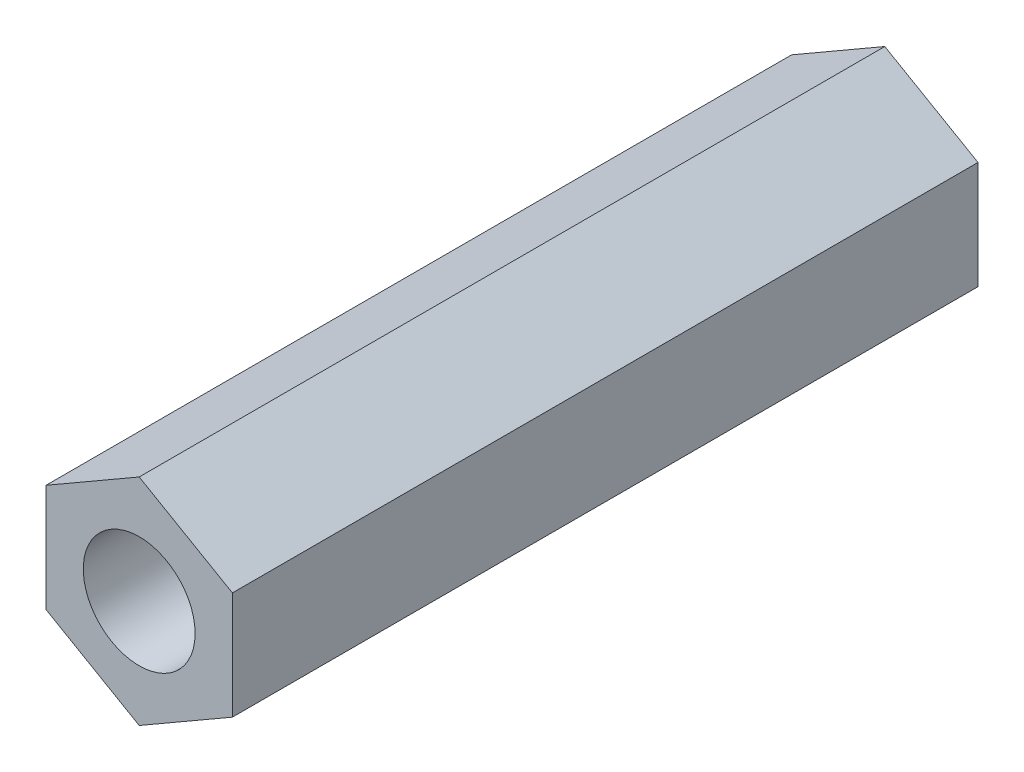
ISO-10303-21;
HEADER;
FILE_DESCRIPTION(('STEP AP214'),'2;1');
FILE_NAME('part.step','',(''),(''),'','','');
FILE_SCHEMA(('AUTOMOTIVE_DESIGN { 1 0 10303 214 1 1 1 1 }'));
ENDSEC;
DATA;
#1=APPLICATION_CONTEXT('core data for automotive mechanical design processes');
#2=APPLICATION_PROTOCOL_DEFINITION('international standard','automotive_design',2000,#1);
#3=PRODUCT_CONTEXT('',#1,'mechanical');
#4=PRODUCT('Part','Part','',(#3));
#5=PRODUCT_RELATED_PRODUCT_CATEGORY('part','',(#4));
#6=PRODUCT_DEFINITION_FORMATION('','',#4);
#7=PRODUCT_DEFINITION_CONTEXT('part definition',#1,'design');
#8=PRODUCT_DEFINITION('design','',#6,#7);
#9=PRODUCT_DEFINITION_SHAPE('','',#8);
#10=(LENGTH_UNIT() NAMED_UNIT(*) SI_UNIT(.MILLI.,.METRE.));
#11=(NAMED_UNIT(*) PLANE_ANGLE_UNIT() SI_UNIT($,.RADIAN.));
#12=(NAMED_UNIT(*) SI_UNIT($,.STERADIAN.) SOLID_ANGLE_UNIT());
#13=UNCERTAINTY_MEASURE_WITH_UNIT(LENGTH_MEASURE(1.E-05),#10,'distance_accuracy_value','');
#14=(GEOMETRIC_REPRESENTATION_CONTEXT(3) GLOBAL_UNCERTAINTY_ASSIGNED_CONTEXT((#13)) GLOBAL_UNIT_ASSIGNED_CONTEXT((#10,
#11,#12)) REPRESENTATION_CONTEXT('',''));
#15=CARTESIAN_POINT('',(0.,0.,0.));
#16=DIRECTION('',(0.,0.,1.));
#17=DIRECTION('',(1.,0.,0.));
#18=AXIS2_PLACEMENT_3D('',#15,#16,#17);
#19=CARTESIAN_POINT('',(0.,0.,20.));
#20=DIRECTION('',(0.,0.,1.));
#21=DIRECTION('',(1.,0.,0.));
#22=AXIS2_PLACEMENT_3D('',#19,#20,#21);
#23=PLANE('',#22);
#24=DIRECTION('',(0.866025403784441,-0.499999999999995,0.));
#25=VECTOR('',#24,1.);
#26=CARTESIAN_POINT('',(-2.49999999999997,-1.44337567297409,20.));
#27=LINE('',#26,#25);
#28=CARTESIAN_POINT('',(-2.49999999999997,-1.44337567297409,20.));
#29=VERTEX_POINT('',#28);
#30=CARTESIAN_POINT('',(0.,-2.88675134594811,20.));
#31=VERTEX_POINT('',#30);
#32=EDGE_CURVE('E131',#29,#31,#27,.T.);
#33=ORIENTED_EDGE('',*,*,#32,.T.);
#34=DIRECTION('',(0.866025403784438,0.500000000000001,0.));
#35=VECTOR('',#34,1.);
#36=CARTESIAN_POINT('',(0.,-2.88675134594811,20.));
#37=LINE('',#36,#35);
#38=CARTESIAN_POINT('',(2.49999999999999,-1.44337567297405,20.));
#39=VERTEX_POINT('',#38);
#40=EDGE_CURVE('E89',#31,#39,#37,.T.);
#41=ORIENTED_EDGE('',*,*,#40,.T.);
#42=DIRECTION('',(0.,1.,0.));
#43=VECTOR('',#42,1.);
#44=CARTESIAN_POINT('',(2.49999999999999,-1.44337567297405,20.));
#45=LINE('',#44,#43);
#46=CARTESIAN_POINT('',(2.49999999999998,1.44337567297407,20.));
#47=VERTEX_POINT('',#46);
#48=EDGE_CURVE('E102',#39,#47,#45,.T.);
#49=ORIENTED_EDGE('',*,*,#48,.T.);
#50=DIRECTION('',(-0.866025403784442,0.499999999999995,0.));
#51=VECTOR('',#50,1.);
#52=CARTESIAN_POINT('',(2.49999999999998,1.44337567297407,20.));
#53=LINE('',#52,#51);
#54=CARTESIAN_POINT('',(0.,2.88675134594811,20.));
#55=VERTEX_POINT('',#54);
#56=EDGE_CURVE('E96',#47,#55,#53,.T.);
#57=ORIENTED_EDGE('',*,*,#56,.T.);
#58=DIRECTION('',(-0.866025403784435,-0.500000000000007,0.));
#59=VECTOR('',#58,1.);
#60=CARTESIAN_POINT('',(0.,2.88675134594811,20.));
#61=LINE('',#60,#59);
#62=CARTESIAN_POINT('',(-2.5,1.44337567297403,20.));
#63=VERTEX_POINT('',#62);
#64=EDGE_CURVE('E100',#55,#63,#61,.T.);
#65=ORIENTED_EDGE('',*,*,#64,.T.);
#66=DIRECTION('',(0.,-1.,0.));
#67=VECTOR('',#66,1.);
#68=CARTESIAN_POINT('',(-2.5,1.44337567297403,20.));
#69=LINE('',#68,#67);
#70=EDGE_CURVE('E52',#63,#29,#69,.T.);
#71=ORIENTED_EDGE('',*,*,#70,.T.);
#72=EDGE_LOOP('',(#33,#41,#49,#57,#65,#71));
#73=FACE_BOUND('',#72,.T.);
#74=CARTESIAN_POINT('',(0.,0.,20.));
#75=DIRECTION('',(0.,0.,1.));
#76=DIRECTION('',(1.,0.,0.));
#77=AXIS2_PLACEMENT_3D('',#74,#75,#76);
#78=CIRCLE('',#77,1.5);
#79=CARTESIAN_POINT('',(1.5,0.,20.));
#80=VERTEX_POINT('',#79);
#81=EDGE_CURVE('E124',#80,#80,#78,.T.);
#82=ORIENTED_EDGE('',*,*,#81,.F.);
#83=EDGE_LOOP('',(#82));
#84=FACE_BOUND('',#83,.T.);
#85=ADVANCED_FACE('F35',(#73,#84),#23,.T.);
#86=CARTESIAN_POINT('',(0.,0.,0.));
#87=DIRECTION('',(0.,0.,1.));
#88=DIRECTION('',(1.,0.,0.));
#89=AXIS2_PLACEMENT_3D('',#86,#87,#88);
#90=PLANE('',#89);
#91=DIRECTION('',(0.866025403784441,-0.499999999999995,0.));
#92=VECTOR('',#91,1.);
#93=CARTESIAN_POINT('',(-2.49999999999997,-1.44337567297409,0.));
#94=LINE('',#93,#92);
#95=CARTESIAN_POINT('',(-2.49999999999997,-1.44337567297409,0.));
#96=VERTEX_POINT('',#95);
#97=CARTESIAN_POINT('',(0.,-2.88675134594811,0.));
#98=VERTEX_POINT('',#97);
#99=EDGE_CURVE('E120',#96,#98,#94,.T.);
#100=ORIENTED_EDGE('',*,*,#99,.F.);
#101=DIRECTION('',(0.,-1.,0.));
#102=VECTOR('',#101,1.);
#103=CARTESIAN_POINT('',(-2.5,1.44337567297403,0.));
#104=LINE('',#103,#102);
#105=CARTESIAN_POINT('',(-2.5,1.44337567297403,0.));
#106=VERTEX_POINT('',#105);
#107=EDGE_CURVE('E81',#106,#96,#104,.T.);
#108=ORIENTED_EDGE('',*,*,#107,.F.);
#109=DIRECTION('',(-0.866025403784435,-0.500000000000007,0.));
#110=VECTOR('',#109,1.);
#111=CARTESIAN_POINT('',(0.,2.88675134594811,0.));
#112=LINE('',#111,#110);
#113=CARTESIAN_POINT('',(0.,2.88675134594811,0.));
#114=VERTEX_POINT('',#113);
#115=EDGE_CURVE('E75',#114,#106,#112,.T.);
#116=ORIENTED_EDGE('',*,*,#115,.F.);
#117=DIRECTION('',(-0.866025403784442,0.499999999999995,0.));
#118=VECTOR('',#117,1.);
#119=CARTESIAN_POINT('',(2.49999999999998,1.44337567297407,0.));
#120=LINE('',#119,#118);
#121=CARTESIAN_POINT('',(2.49999999999998,1.44337567297407,0.));
#122=VERTEX_POINT('',#121);
#123=EDGE_CURVE('E110',#122,#114,#120,.T.);
#124=ORIENTED_EDGE('',*,*,#123,.F.);
#125=DIRECTION('',(0.,1.,0.));
#126=VECTOR('',#125,1.);
#127=CARTESIAN_POINT('',(2.49999999999999,-1.44337567297405,0.));
#128=LINE('',#127,#126);
#129=CARTESIAN_POINT('',(2.49999999999999,-1.44337567297405,0.));
#130=VERTEX_POINT('',#129);
#131=EDGE_CURVE('E126',#130,#122,#128,.T.);
#132=ORIENTED_EDGE('',*,*,#131,.F.);
#133=DIRECTION('',(0.866025403784438,0.500000000000001,0.));
#134=VECTOR('',#133,1.);
#135=CARTESIAN_POINT('',(0.,-2.88675134594811,0.));
#136=LINE('',#135,#134);
#137=EDGE_CURVE('E123',#98,#130,#136,.T.);
#138=ORIENTED_EDGE('',*,*,#137,.F.);
#139=EDGE_LOOP('',(#100,#108,#116,#124,#132,#138));
#140=FACE_BOUND('',#139,.T.);
#141=CARTESIAN_POINT('',(0.,0.,0.));
#142=DIRECTION('',(0.,0.,1.));
#143=DIRECTION('',(1.,0.,0.));
#144=AXIS2_PLACEMENT_3D('',#141,#142,#143);
#145=CIRCLE('',#144,1.5);
#146=CARTESIAN_POINT('',(1.5,0.,0.));
#147=VERTEX_POINT('',#146);
#148=EDGE_CURVE('E224',#147,#147,#145,.T.);
#149=ORIENTED_EDGE('',*,*,#148,.T.);
#150=EDGE_LOOP('',(#149));
#151=FACE_BOUND('',#150,.T.);
#152=ADVANCED_FACE('F140',(#140,#151),#90,.F.);
#153=CARTESIAN_POINT('',(-2.49999999999997,-1.44337567297409,20.));
#154=DIRECTION('',(0.499999999999995,0.866025403784442,0.));
#155=DIRECTION('',(-0.866025403784442,0.499999999999995,0.));
#156=AXIS2_PLACEMENT_3D('',#153,#154,#155);
#157=PLANE('',#156);
#158=ORIENTED_EDGE('',*,*,#99,.T.);
#159=DIRECTION('',(0.,0.,-1.));
#160=VECTOR('',#159,1.);
#161=CARTESIAN_POINT('',(0.,-2.88675134594811,20.));
#162=LINE('',#161,#160);
#163=EDGE_CURVE('E11',#31,#98,#162,.T.);
#164=ORIENTED_EDGE('',*,*,#163,.F.);
#165=ORIENTED_EDGE('',*,*,#32,.F.);
#166=DIRECTION('',(0.,0.,-1.));
#167=VECTOR('',#166,1.);
#168=CARTESIAN_POINT('',(-2.49999999999997,-1.44337567297409,20.));
#169=LINE('',#168,#167);
#170=EDGE_CURVE('E116',#29,#96,#169,.T.);
#171=ORIENTED_EDGE('',*,*,#170,.T.);
#172=EDGE_LOOP('',(#158,#164,#165,#171));
#173=FACE_BOUND('',#172,.T.);
#174=ADVANCED_FACE('F37',(#173),#157,.F.);
#175=CARTESIAN_POINT('',(0.,-2.88675134594811,20.));
#176=DIRECTION('',(-0.500000000000001,0.866025403784438,0.));
#177=DIRECTION('',(-0.866025403784438,-0.500000000000001,0.));
#178=AXIS2_PLACEMENT_3D('',#175,#176,#177);
#179=PLANE('',#178);
#180=ORIENTED_EDGE('',*,*,#137,.T.);
#181=DIRECTION('',(0.,0.,-1.));
#182=VECTOR('',#181,1.);
#183=CARTESIAN_POINT('',(2.49999999999999,-1.44337567297405,20.));
#184=LINE('',#183,#182);
#185=EDGE_CURVE('E44',#39,#130,#184,.T.);
#186=ORIENTED_EDGE('',*,*,#185,.F.);
#187=ORIENTED_EDGE('',*,*,#40,.F.);
#188=ORIENTED_EDGE('',*,*,#163,.T.);
#189=EDGE_LOOP('',(#180,#186,#187,#188));
#190=FACE_BOUND('',#189,.T.);
#191=ADVANCED_FACE('F165',(#190),#179,.F.);
#192=CARTESIAN_POINT('',(2.49999999999999,-1.44337567297405,20.));
#193=DIRECTION('',(-1.,0.,0.));
#194=DIRECTION('',(0.,-1.,0.));
#195=AXIS2_PLACEMENT_3D('',#192,#193,#194);
#196=PLANE('',#195);
#197=ORIENTED_EDGE('',*,*,#131,.T.);
#198=DIRECTION('',(0.,0.,-1.));
#199=VECTOR('',#198,1.);
#200=CARTESIAN_POINT('',(2.49999999999998,1.44337567297407,20.));
#201=LINE('',#200,#199);
#202=EDGE_CURVE('E111',#47,#122,#201,.T.);
#203=ORIENTED_EDGE('',*,*,#202,.F.);
#204=ORIENTED_EDGE('',*,*,#48,.F.);
#205=ORIENTED_EDGE('',*,*,#185,.T.);
#206=EDGE_LOOP('',(#197,#203,#204,#205));
#207=FACE_BOUND('',#206,.T.);
#208=ADVANCED_FACE('F137',(#207),#196,.F.);
#209=CARTESIAN_POINT('',(2.49999999999998,1.44337567297407,20.));
#210=DIRECTION('',(-0.499999999999995,-0.866025403784442,0.));
#211=DIRECTION('',(0.866025403784442,-0.499999999999995,0.));
#212=AXIS2_PLACEMENT_3D('',#209,#210,#211);
#213=PLANE('',#212);
#214=ORIENTED_EDGE('',*,*,#123,.T.);
#215=DIRECTION('',(0.,0.,-1.));
#216=VECTOR('',#215,1.);
#217=CARTESIAN_POINT('',(0.,2.88675134594811,20.));
#218=LINE('',#217,#216);
#219=EDGE_CURVE('E107',#55,#114,#218,.T.);
#220=ORIENTED_EDGE('',*,*,#219,.F.);
#221=ORIENTED_EDGE('',*,*,#56,.F.);
#222=ORIENTED_EDGE('',*,*,#202,.T.);
#223=EDGE_LOOP('',(#214,#220,#221,#222));
#224=FACE_BOUND('',#223,.T.);
#225=ADVANCED_FACE('F108',(#224),#213,.F.);
#226=CARTESIAN_POINT('',(0.,2.88675134594811,20.));
#227=DIRECTION('',(0.500000000000007,-0.866025403784435,0.));
#228=DIRECTION('',(0.866025403784435,0.500000000000007,0.));
#229=AXIS2_PLACEMENT_3D('',#226,#227,#228);
#230=PLANE('',#229);
#231=ORIENTED_EDGE('',*,*,#115,.T.);
#232=DIRECTION('',(0.,0.,-1.));
#233=VECTOR('',#232,1.);
#234=CARTESIAN_POINT('',(-2.5,1.44337567297403,20.));
#235=LINE('',#234,#233);
#236=EDGE_CURVE('E112',#63,#106,#235,.T.);
#237=ORIENTED_EDGE('',*,*,#236,.F.);
#238=ORIENTED_EDGE('',*,*,#64,.F.);
#239=ORIENTED_EDGE('',*,*,#219,.T.);
#240=EDGE_LOOP('',(#231,#237,#238,#239));
#241=FACE_BOUND('',#240,.T.);
#242=ADVANCED_FACE('F114',(#241),#230,.F.);
#243=CARTESIAN_POINT('',(-2.5,1.44337567297403,20.));
#244=DIRECTION('',(1.,0.,0.));
#245=DIRECTION('',(0.,1.,0.));
#246=AXIS2_PLACEMENT_3D('',#243,#244,#245);
#247=PLANE('',#246);
#248=ORIENTED_EDGE('',*,*,#107,.T.);
#249=ORIENTED_EDGE('',*,*,#170,.F.);
#250=ORIENTED_EDGE('',*,*,#70,.F.);
#251=ORIENTED_EDGE('',*,*,#236,.T.);
#252=EDGE_LOOP('',(#248,#249,#250,#251));
#253=FACE_BOUND('',#252,.T.);
#254=ADVANCED_FACE('F145',(#253),#247,.F.);
#255=CARTESIAN_POINT('',(0.,0.,20.));
#256=DIRECTION('',(0.,0.,-1.));
#257=DIRECTION('',(-1.,0.,0.));
#258=AXIS2_PLACEMENT_3D('',#255,#256,#257);
#259=CYLINDRICAL_SURFACE('',#258,1.5);
#260=ORIENTED_EDGE('',*,*,#81,.T.);
#261=EDGE_LOOP('',(#260));
#262=FACE_BOUND('',#261,.T.);
#263=ORIENTED_EDGE('',*,*,#148,.F.);
#264=EDGE_LOOP('',(#263));
#265=FACE_BOUND('',#264,.T.);
#266=ADVANCED_FACE('F147',(#262,#265),#259,.F.);
#267=CLOSED_SHELL('',(#85,#152,#174,#191,#208,#225,#242,#254,#266));
#268=MANIFOLD_SOLID_BREP('B2',#267);
#269=ADVANCED_BREP_SHAPE_REPRESENTATION('',(#18,#268),#14);
#270=SHAPE_DEFINITION_REPRESENTATION(#9,#269);
ENDSEC;
END-ISO-10303-21;
